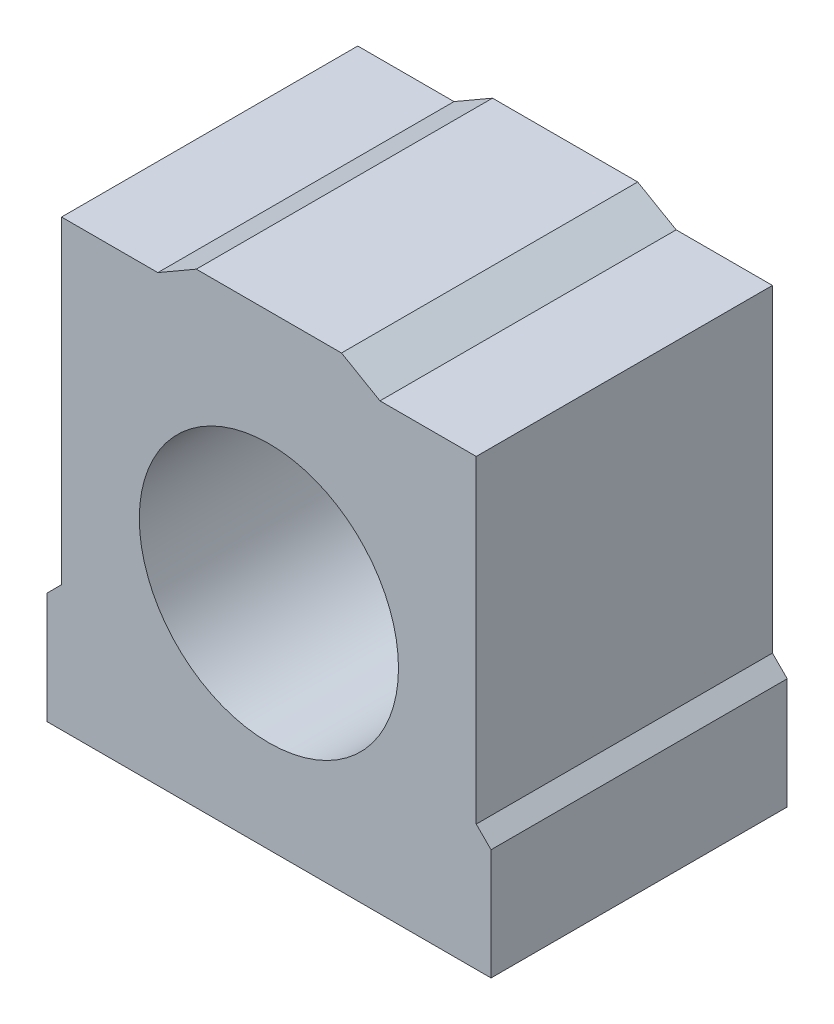
ISO-10303-21;
HEADER;
FILE_DESCRIPTION(('STEP AP214'),'2;1');
FILE_NAME('part.step','',(''),(''),'','','');
FILE_SCHEMA(('AUTOMOTIVE_DESIGN { 1 0 10303 214 1 1 1 1 }'));
ENDSEC;
DATA;
#1=APPLICATION_CONTEXT('core data for automotive mechanical design processes');
#2=APPLICATION_PROTOCOL_DEFINITION('international standard','automotive_design',2000,#1);
#3=PRODUCT_CONTEXT('',#1,'mechanical');
#4=PRODUCT('Part','Part','',(#3));
#5=PRODUCT_RELATED_PRODUCT_CATEGORY('part','',(#4));
#6=PRODUCT_DEFINITION_FORMATION('','',#4);
#7=PRODUCT_DEFINITION_CONTEXT('part definition',#1,'design');
#8=PRODUCT_DEFINITION('design','',#6,#7);
#9=PRODUCT_DEFINITION_SHAPE('','',#8);
#10=(LENGTH_UNIT() NAMED_UNIT(*) SI_UNIT(.MILLI.,.METRE.));
#11=(NAMED_UNIT(*) PLANE_ANGLE_UNIT() SI_UNIT($,.RADIAN.));
#12=(NAMED_UNIT(*) SI_UNIT($,.STERADIAN.) SOLID_ANGLE_UNIT());
#13=UNCERTAINTY_MEASURE_WITH_UNIT(LENGTH_MEASURE(1.E-05),#10,'distance_accuracy_value','');
#14=(GEOMETRIC_REPRESENTATION_CONTEXT(3) GLOBAL_UNCERTAINTY_ASSIGNED_CONTEXT((#13)) GLOBAL_UNIT_ASSIGNED_CONTEXT((#10,
#11,#12)) REPRESENTATION_CONTEXT('',''));
#15=CARTESIAN_POINT('',(0.,0.,0.));
#16=DIRECTION('',(0.,0.,1.));
#17=DIRECTION('',(1.,0.,0.));
#18=AXIS2_PLACEMENT_3D('',#15,#16,#17);
#19=CARTESIAN_POINT('',(0.,0.,20.));
#20=DIRECTION('',(0.,0.,-1.));
#21=DIRECTION('',(-1.,0.,0.));
#22=AXIS2_PLACEMENT_3D('',#19,#20,#21);
#23=PLANE('',#22);
#24=DIRECTION('',(0.,-1.,0.));
#25=VECTOR('',#24,1.);
#26=CARTESIAN_POINT('',(-30.,15.,20.));
#27=LINE('',#26,#25);
#28=CARTESIAN_POINT('',(-30.,15.,20.));
#29=VERTEX_POINT('',#28);
#30=CARTESIAN_POINT('',(-30.,0.,20.));
#31=VERTEX_POINT('',#30);
#32=EDGE_CURVE('E180',#29,#31,#27,.T.);
#33=ORIENTED_EDGE('',*,*,#32,.T.);
#34=DIRECTION('',(1.,0.,0.));
#35=VECTOR('',#34,1.);
#36=CARTESIAN_POINT('',(30.,0.,20.));
#37=LINE('',#36,#35);
#38=CARTESIAN_POINT('',(30.,0.,20.));
#39=VERTEX_POINT('',#38);
#40=EDGE_CURVE('E106',#31,#39,#37,.T.);
#41=ORIENTED_EDGE('',*,*,#40,.T.);
#42=DIRECTION('',(0.,1.,0.));
#43=VECTOR('',#42,1.);
#44=CARTESIAN_POINT('',(30.,15.,20.));
#45=LINE('',#44,#43);
#46=CARTESIAN_POINT('',(30.,15.,20.));
#47=VERTEX_POINT('',#46);
#48=EDGE_CURVE('E207',#39,#47,#45,.T.);
#49=ORIENTED_EDGE('',*,*,#48,.T.);
#50=DIRECTION('',(-0.707106781186544,0.707106781186551,0.));
#51=VECTOR('',#50,1.);
#52=CARTESIAN_POINT('',(28.,17.,20.));
#53=LINE('',#52,#51);
#54=CARTESIAN_POINT('',(28.,17.,20.));
#55=VERTEX_POINT('',#54);
#56=EDGE_CURVE('E226',#47,#55,#53,.T.);
#57=ORIENTED_EDGE('',*,*,#56,.T.);
#58=DIRECTION('',(0.,1.,0.));
#59=VECTOR('',#58,1.);
#60=CARTESIAN_POINT('',(28.,17.,20.));
#61=LINE('',#60,#59);
#62=CARTESIAN_POINT('',(28.,60.,20.));
#63=VERTEX_POINT('',#62);
#64=EDGE_CURVE('E223',#55,#63,#61,.T.);
#65=ORIENTED_EDGE('',*,*,#64,.T.);
#66=DIRECTION('',(-1.,0.,0.));
#67=VECTOR('',#66,1.);
#68=CARTESIAN_POINT('',(28.,60.,20.));
#69=LINE('',#68,#67);
#70=CARTESIAN_POINT('',(15.,60.,20.));
#71=VERTEX_POINT('',#70);
#72=EDGE_CURVE('E225',#63,#71,#69,.T.);
#73=ORIENTED_EDGE('',*,*,#72,.T.);
#74=DIRECTION('',(-0.866025403784442,0.499999999999995,0.));
#75=VECTOR('',#74,1.);
#76=CARTESIAN_POINT('',(15.,60.,20.));
#77=LINE('',#76,#75);
#78=CARTESIAN_POINT('',(9.80384757729329,63.,20.));
#79=VERTEX_POINT('',#78);
#80=EDGE_CURVE('E228',#71,#79,#77,.T.);
#81=ORIENTED_EDGE('',*,*,#80,.T.);
#82=DIRECTION('',(-1.,0.,0.));
#83=VECTOR('',#82,1.);
#84=CARTESIAN_POINT('',(-9.80384757729329,63.,20.));
#85=LINE('',#84,#83);
#86=CARTESIAN_POINT('',(-9.80384757729329,63.,20.));
#87=VERTEX_POINT('',#86);
#88=EDGE_CURVE('E234',#79,#87,#85,.T.);
#89=ORIENTED_EDGE('',*,*,#88,.T.);
#90=DIRECTION('',(-0.866025403784442,-0.499999999999995,0.));
#91=VECTOR('',#90,1.);
#92=CARTESIAN_POINT('',(-15.,60.,20.));
#93=LINE('',#92,#91);
#94=CARTESIAN_POINT('',(-15.,60.,20.));
#95=VERTEX_POINT('',#94);
#96=EDGE_CURVE('E139',#87,#95,#93,.T.);
#97=ORIENTED_EDGE('',*,*,#96,.T.);
#98=DIRECTION('',(-1.,0.,0.));
#99=VECTOR('',#98,1.);
#100=CARTESIAN_POINT('',(-15.,60.,20.));
#101=LINE('',#100,#99);
#102=CARTESIAN_POINT('',(-28.,60.,20.));
#103=VERTEX_POINT('',#102);
#104=EDGE_CURVE('E133',#95,#103,#101,.T.);
#105=ORIENTED_EDGE('',*,*,#104,.T.);
#106=DIRECTION('',(0.,-1.,0.));
#107=VECTOR('',#106,1.);
#108=CARTESIAN_POINT('',(-28.,17.,20.));
#109=LINE('',#108,#107);
#110=CARTESIAN_POINT('',(-28.,17.,20.));
#111=VERTEX_POINT('',#110);
#112=EDGE_CURVE('E137',#103,#111,#109,.T.);
#113=ORIENTED_EDGE('',*,*,#112,.T.);
#114=DIRECTION('',(-0.707106781186544,-0.707106781186551,0.));
#115=VECTOR('',#114,1.);
#116=CARTESIAN_POINT('',(-28.,17.,20.));
#117=LINE('',#116,#115);
#118=EDGE_CURVE('E50',#111,#29,#117,.T.);
#119=ORIENTED_EDGE('',*,*,#118,.T.);
#120=EDGE_LOOP('',(#33,#41,#49,#57,#65,#73,#81,#89,#97,#105,#113,#119));
#121=FACE_BOUND('',#120,.T.);
#122=CARTESIAN_POINT('',(0.,30.,20.));
#123=DIRECTION('',(0.,0.,1.));
#124=DIRECTION('',(1.,0.,0.));
#125=AXIS2_PLACEMENT_3D('',#122,#123,#124);
#126=CIRCLE('',#125,17.5);
#127=CARTESIAN_POINT('',(17.5,30.,20.));
#128=VERTEX_POINT('',#127);
#129=EDGE_CURVE('E161',#128,#128,#126,.T.);
#130=ORIENTED_EDGE('',*,*,#129,.F.);
#131=EDGE_LOOP('',(#130));
#132=FACE_BOUND('',#131,.T.);
#133=ADVANCED_FACE('F33',(#121,#132),#23,.F.);
#134=CARTESIAN_POINT('',(0.,0.,-20.));
#135=DIRECTION('',(0.,0.,-1.));
#136=DIRECTION('',(-1.,0.,0.));
#137=AXIS2_PLACEMENT_3D('',#134,#135,#136);
#138=PLANE('',#137);
#139=DIRECTION('',(0.,-1.,0.));
#140=VECTOR('',#139,1.);
#141=CARTESIAN_POINT('',(-30.,15.,-20.));
#142=LINE('',#141,#140);
#143=CARTESIAN_POINT('',(-30.,15.,-20.));
#144=VERTEX_POINT('',#143);
#145=CARTESIAN_POINT('',(-30.,0.,-20.));
#146=VERTEX_POINT('',#145);
#147=EDGE_CURVE('E157',#144,#146,#142,.T.);
#148=ORIENTED_EDGE('',*,*,#147,.F.);
#149=DIRECTION('',(-0.707106781186544,-0.707106781186551,0.));
#150=VECTOR('',#149,1.);
#151=CARTESIAN_POINT('',(-28.,17.,-20.));
#152=LINE('',#151,#150);
#153=CARTESIAN_POINT('',(-28.,17.,-20.));
#154=VERTEX_POINT('',#153);
#155=EDGE_CURVE('E98',#154,#144,#152,.T.);
#156=ORIENTED_EDGE('',*,*,#155,.F.);
#157=DIRECTION('',(0.,-1.,0.));
#158=VECTOR('',#157,1.);
#159=CARTESIAN_POINT('',(-28.,17.,-20.));
#160=LINE('',#159,#158);
#161=CARTESIAN_POINT('',(-28.,60.,-20.));
#162=VERTEX_POINT('',#161);
#163=EDGE_CURVE('E92',#162,#154,#160,.T.);
#164=ORIENTED_EDGE('',*,*,#163,.F.);
#165=DIRECTION('',(-1.,0.,0.));
#166=VECTOR('',#165,1.);
#167=CARTESIAN_POINT('',(-15.,60.,-20.));
#168=LINE('',#167,#166);
#169=CARTESIAN_POINT('',(-15.,60.,-20.));
#170=VERTEX_POINT('',#169);
#171=EDGE_CURVE('E147',#170,#162,#168,.T.);
#172=ORIENTED_EDGE('',*,*,#171,.F.);
#173=DIRECTION('',(-0.866025403784442,-0.499999999999995,0.));
#174=VECTOR('',#173,1.);
#175=CARTESIAN_POINT('',(-15.,60.,-20.));
#176=LINE('',#175,#174);
#177=CARTESIAN_POINT('',(-9.80384757729329,63.,-20.));
#178=VERTEX_POINT('',#177);
#179=EDGE_CURVE('E175',#178,#170,#176,.T.);
#180=ORIENTED_EDGE('',*,*,#179,.F.);
#181=DIRECTION('',(-1.,0.,0.));
#182=VECTOR('',#181,1.);
#183=CARTESIAN_POINT('',(-9.80384757729329,63.,-20.));
#184=LINE('',#183,#182);
#185=CARTESIAN_POINT('',(9.80384757729329,63.,-20.));
#186=VERTEX_POINT('',#185);
#187=EDGE_CURVE('E173',#186,#178,#184,.T.);
#188=ORIENTED_EDGE('',*,*,#187,.F.);
#189=DIRECTION('',(-0.866025403784442,0.499999999999995,0.));
#190=VECTOR('',#189,1.);
#191=CARTESIAN_POINT('',(15.,60.,-20.));
#192=LINE('',#191,#190);
#193=CARTESIAN_POINT('',(15.,60.,-20.));
#194=VERTEX_POINT('',#193);
#195=EDGE_CURVE('E171',#194,#186,#192,.T.);
#196=ORIENTED_EDGE('',*,*,#195,.F.);
#197=DIRECTION('',(-1.,0.,0.));
#198=VECTOR('',#197,1.);
#199=CARTESIAN_POINT('',(28.,60.,-20.));
#200=LINE('',#199,#198);
#201=CARTESIAN_POINT('',(28.,60.,-20.));
#202=VERTEX_POINT('',#201);
#203=EDGE_CURVE('E169',#202,#194,#200,.T.);
#204=ORIENTED_EDGE('',*,*,#203,.F.);
#205=DIRECTION('',(0.,1.,0.));
#206=VECTOR('',#205,1.);
#207=CARTESIAN_POINT('',(28.,17.,-20.));
#208=LINE('',#207,#206);
#209=CARTESIAN_POINT('',(28.,17.,-20.));
#210=VERTEX_POINT('',#209);
#211=EDGE_CURVE('E167',#210,#202,#208,.T.);
#212=ORIENTED_EDGE('',*,*,#211,.F.);
#213=DIRECTION('',(-0.707106781186544,0.707106781186551,0.));
#214=VECTOR('',#213,1.);
#215=CARTESIAN_POINT('',(28.,17.,-20.));
#216=LINE('',#215,#214);
#217=CARTESIAN_POINT('',(30.,15.,-20.));
#218=VERTEX_POINT('',#217);
#219=EDGE_CURVE('E165',#218,#210,#216,.T.);
#220=ORIENTED_EDGE('',*,*,#219,.F.);
#221=DIRECTION('',(0.,1.,0.));
#222=VECTOR('',#221,1.);
#223=CARTESIAN_POINT('',(30.,15.,-20.));
#224=LINE('',#223,#222);
#225=CARTESIAN_POINT('',(30.,0.,-20.));
#226=VERTEX_POINT('',#225);
#227=EDGE_CURVE('E163',#226,#218,#224,.T.);
#228=ORIENTED_EDGE('',*,*,#227,.F.);
#229=DIRECTION('',(1.,0.,0.));
#230=VECTOR('',#229,1.);
#231=CARTESIAN_POINT('',(30.,0.,-20.));
#232=LINE('',#231,#230);
#233=EDGE_CURVE('E160',#146,#226,#232,.T.);
#234=ORIENTED_EDGE('',*,*,#233,.F.);
#235=EDGE_LOOP('',(#148,#156,#164,#172,#180,#188,#196,#204,#212,#220,#228,#234));
#236=FACE_BOUND('',#235,.T.);
#237=CARTESIAN_POINT('',(0.,30.,-20.));
#238=DIRECTION('',(0.,0.,1.));
#239=DIRECTION('',(1.,0.,0.));
#240=AXIS2_PLACEMENT_3D('',#237,#238,#239);
#241=CIRCLE('',#240,17.5);
#242=CARTESIAN_POINT('',(17.5,30.,-20.));
#243=VERTEX_POINT('',#242);
#244=EDGE_CURVE('E328',#243,#243,#241,.T.);
#245=ORIENTED_EDGE('',*,*,#244,.T.);
#246=EDGE_LOOP('',(#245));
#247=FACE_BOUND('',#246,.T.);
#248=ADVANCED_FACE('F211',(#236,#247),#138,.T.);
#249=CARTESIAN_POINT('',(-30.,15.,20.));
#250=DIRECTION('',(1.,0.,0.));
#251=DIRECTION('',(0.,1.,0.));
#252=AXIS2_PLACEMENT_3D('',#249,#250,#251);
#253=PLANE('',#252);
#254=ORIENTED_EDGE('',*,*,#147,.T.);
#255=DIRECTION('',(0.,0.,-1.));
#256=VECTOR('',#255,1.);
#257=CARTESIAN_POINT('',(-30.,0.,20.));
#258=LINE('',#257,#256);
#259=EDGE_CURVE('E11',#31,#146,#258,.T.);
#260=ORIENTED_EDGE('',*,*,#259,.F.);
#261=ORIENTED_EDGE('',*,*,#32,.F.);
#262=DIRECTION('',(0.,0.,-1.));
#263=VECTOR('',#262,1.);
#264=CARTESIAN_POINT('',(-30.,15.,20.));
#265=LINE('',#264,#263);
#266=EDGE_CURVE('E153',#29,#144,#265,.T.);
#267=ORIENTED_EDGE('',*,*,#266,.T.);
#268=EDGE_LOOP('',(#254,#260,#261,#267));
#269=FACE_BOUND('',#268,.T.);
#270=ADVANCED_FACE('F35',(#269),#253,.F.);
#271=CARTESIAN_POINT('',(30.,0.,20.));
#272=DIRECTION('',(0.,1.,0.));
#273=DIRECTION('',(0.,0.,1.));
#274=AXIS2_PLACEMENT_3D('',#271,#272,#273);
#275=PLANE('',#274);
#276=CARTESIAN_POINT('',(-20.,0.,-10.));
#277=DIRECTION('',(0.,-1.,0.));
#278=DIRECTION('',(0.,0.,-1.));
#279=AXIS2_PLACEMENT_3D('',#276,#277,#278);
#280=CIRCLE('',#279,2.5527);
#281=CARTESIAN_POINT('',(-20.,0.,-12.5527));
#282=VERTEX_POINT('',#281);
#283=EDGE_CURVE('E305',#282,#282,#280,.T.);
#284=ORIENTED_EDGE('',*,*,#283,.F.);
#285=EDGE_LOOP('',(#284));
#286=FACE_BOUND('',#285,.T.);
#287=CARTESIAN_POINT('',(-20.,0.,10.));
#288=DIRECTION('',(0.,-1.,0.));
#289=DIRECTION('',(0.,0.,-1.));
#290=AXIS2_PLACEMENT_3D('',#287,#288,#289);
#291=CIRCLE('',#290,2.5527);
#292=CARTESIAN_POINT('',(-20.,0.,7.4473));
#293=VERTEX_POINT('',#292);
#294=EDGE_CURVE('E308',#293,#293,#291,.T.);
#295=ORIENTED_EDGE('',*,*,#294,.F.);
#296=EDGE_LOOP('',(#295));
#297=FACE_BOUND('',#296,.T.);
#298=CARTESIAN_POINT('',(20.,0.,9.99999999999999));
#299=DIRECTION('',(0.,-1.,0.));
#300=DIRECTION('',(0.,0.,-1.));
#301=AXIS2_PLACEMENT_3D('',#298,#299,#300);
#302=CIRCLE('',#301,2.5527);
#303=CARTESIAN_POINT('',(20.,0.,7.44729999999999));
#304=VERTEX_POINT('',#303);
#305=EDGE_CURVE('E316',#304,#304,#302,.T.);
#306=ORIENTED_EDGE('',*,*,#305,.F.);
#307=EDGE_LOOP('',(#306));
#308=FACE_BOUND('',#307,.T.);
#309=CARTESIAN_POINT('',(20.,0.,-9.99999999999999));
#310=DIRECTION('',(0.,-1.,0.));
#311=DIRECTION('',(0.,0.,-1.));
#312=AXIS2_PLACEMENT_3D('',#309,#310,#311);
#313=CIRCLE('',#312,2.5527);
#314=CARTESIAN_POINT('',(20.,0.,-12.5527));
#315=VERTEX_POINT('',#314);
#316=EDGE_CURVE('E322',#315,#315,#313,.T.);
#317=ORIENTED_EDGE('',*,*,#316,.F.);
#318=EDGE_LOOP('',(#317));
#319=FACE_BOUND('',#318,.T.);
#320=ORIENTED_EDGE('',*,*,#233,.T.);
#321=DIRECTION('',(0.,0.,-1.));
#322=VECTOR('',#321,1.);
#323=CARTESIAN_POINT('',(30.,0.,20.));
#324=LINE('',#323,#322);
#325=EDGE_CURVE('E42',#39,#226,#324,.T.);
#326=ORIENTED_EDGE('',*,*,#325,.F.);
#327=ORIENTED_EDGE('',*,*,#40,.F.);
#328=ORIENTED_EDGE('',*,*,#259,.T.);
#329=EDGE_LOOP('',(#320,#326,#327,#328));
#330=FACE_BOUND('',#329,.T.);
#331=ADVANCED_FACE('F342',(#286,#297,#308,#319,#330),#275,.F.);
#332=CARTESIAN_POINT('',(30.,15.,20.));
#333=DIRECTION('',(-1.,0.,0.));
#334=DIRECTION('',(0.,-1.,0.));
#335=AXIS2_PLACEMENT_3D('',#332,#333,#334);
#336=PLANE('',#335);
#337=ORIENTED_EDGE('',*,*,#227,.T.);
#338=DIRECTION('',(0.,0.,-1.));
#339=VECTOR('',#338,1.);
#340=CARTESIAN_POINT('',(30.,15.,20.));
#341=LINE('',#340,#339);
#342=EDGE_CURVE('E199',#47,#218,#341,.T.);
#343=ORIENTED_EDGE('',*,*,#342,.F.);
#344=ORIENTED_EDGE('',*,*,#48,.F.);
#345=ORIENTED_EDGE('',*,*,#325,.T.);
#346=EDGE_LOOP('',(#337,#343,#344,#345));
#347=FACE_BOUND('',#346,.T.);
#348=ADVANCED_FACE('F205',(#347),#336,.F.);
#349=CARTESIAN_POINT('',(28.,17.,20.));
#350=DIRECTION('',(-0.707106781186551,-0.707106781186544,0.));
#351=DIRECTION('',(0.707106781186544,-0.707106781186551,0.));
#352=AXIS2_PLACEMENT_3D('',#349,#350,#351);
#353=PLANE('',#352);
#354=ORIENTED_EDGE('',*,*,#219,.T.);
#355=DIRECTION('',(0.,0.,-1.));
#356=VECTOR('',#355,1.);
#357=CARTESIAN_POINT('',(28.,17.,20.));
#358=LINE('',#357,#356);
#359=EDGE_CURVE('E196',#55,#210,#358,.T.);
#360=ORIENTED_EDGE('',*,*,#359,.F.);
#361=ORIENTED_EDGE('',*,*,#56,.F.);
#362=ORIENTED_EDGE('',*,*,#342,.T.);
#363=EDGE_LOOP('',(#354,#360,#361,#362));
#364=FACE_BOUND('',#363,.T.);
#365=ADVANCED_FACE('F217',(#364),#353,.F.);
#366=CARTESIAN_POINT('',(28.,17.,20.));
#367=DIRECTION('',(-1.,0.,0.));
#368=DIRECTION('',(0.,0.,1.));
#369=AXIS2_PLACEMENT_3D('',#366,#367,#368);
#370=PLANE('',#369);
#371=ORIENTED_EDGE('',*,*,#211,.T.);
#372=DIRECTION('',(0.,0.,-1.));
#373=VECTOR('',#372,1.);
#374=CARTESIAN_POINT('',(28.,60.,20.));
#375=LINE('',#374,#373);
#376=EDGE_CURVE('E193',#63,#202,#375,.T.);
#377=ORIENTED_EDGE('',*,*,#376,.F.);
#378=ORIENTED_EDGE('',*,*,#64,.F.);
#379=ORIENTED_EDGE('',*,*,#359,.T.);
#380=EDGE_LOOP('',(#371,#377,#378,#379));
#381=FACE_BOUND('',#380,.T.);
#382=ADVANCED_FACE('F221',(#381),#370,.F.);
#383=CARTESIAN_POINT('',(28.,60.,20.));
#384=DIRECTION('',(0.,-1.,0.));
#385=DIRECTION('',(1.,0.,0.));
#386=AXIS2_PLACEMENT_3D('',#383,#384,#385);
#387=PLANE('',#386);
#388=ORIENTED_EDGE('',*,*,#203,.T.);
#389=DIRECTION('',(0.,0.,-1.));
#390=VECTOR('',#389,1.);
#391=CARTESIAN_POINT('',(15.,60.,20.));
#392=LINE('',#391,#390);
#393=EDGE_CURVE('E190',#71,#194,#392,.T.);
#394=ORIENTED_EDGE('',*,*,#393,.F.);
#395=ORIENTED_EDGE('',*,*,#72,.F.);
#396=ORIENTED_EDGE('',*,*,#376,.T.);
#397=EDGE_LOOP('',(#388,#394,#395,#396));
#398=FACE_BOUND('',#397,.T.);
#399=ADVANCED_FACE('F355',(#398),#387,.F.);
#400=CARTESIAN_POINT('',(15.,60.,20.));
#401=DIRECTION('',(-0.499999999999995,-0.866025403784442,0.));
#402=DIRECTION('',(0.866025403784442,-0.499999999999995,0.));
#403=AXIS2_PLACEMENT_3D('',#400,#401,#402);
#404=PLANE('',#403);
#405=ORIENTED_EDGE('',*,*,#195,.T.);
#406=DIRECTION('',(0.,0.,-1.));
#407=VECTOR('',#406,1.);
#408=CARTESIAN_POINT('',(9.80384757729329,63.,20.));
#409=LINE('',#408,#407);
#410=EDGE_CURVE('E187',#79,#186,#409,.T.);
#411=ORIENTED_EDGE('',*,*,#410,.F.);
#412=ORIENTED_EDGE('',*,*,#80,.F.);
#413=ORIENTED_EDGE('',*,*,#393,.T.);
#414=EDGE_LOOP('',(#405,#411,#412,#413));
#415=FACE_BOUND('',#414,.T.);
#416=ADVANCED_FACE('F358',(#415),#404,.F.);
#417=CARTESIAN_POINT('',(-9.80384757729329,63.,20.));
#418=DIRECTION('',(0.,-1.,0.));
#419=DIRECTION('',(0.,0.,-1.));
#420=AXIS2_PLACEMENT_3D('',#417,#418,#419);
#421=PLANE('',#420);
#422=ORIENTED_EDGE('',*,*,#187,.T.);
#423=DIRECTION('',(0.,0.,-1.));
#424=VECTOR('',#423,1.);
#425=CARTESIAN_POINT('',(-9.80384757729329,63.,20.));
#426=LINE('',#425,#424);
#427=EDGE_CURVE('E184',#87,#178,#426,.T.);
#428=ORIENTED_EDGE('',*,*,#427,.F.);
#429=ORIENTED_EDGE('',*,*,#88,.F.);
#430=ORIENTED_EDGE('',*,*,#410,.T.);
#431=EDGE_LOOP('',(#422,#428,#429,#430));
#432=FACE_BOUND('',#431,.T.);
#433=ADVANCED_FACE('F240',(#432),#421,.F.);
#434=CARTESIAN_POINT('',(-15.,60.,20.));
#435=DIRECTION('',(0.499999999999995,-0.866025403784442,0.));
#436=DIRECTION('',(0.866025403784442,0.499999999999995,0.));
#437=AXIS2_PLACEMENT_3D('',#434,#435,#436);
#438=PLANE('',#437);
#439=ORIENTED_EDGE('',*,*,#179,.T.);
#440=DIRECTION('',(0.,0.,-1.));
#441=VECTOR('',#440,1.);
#442=CARTESIAN_POINT('',(-15.,60.,20.));
#443=LINE('',#442,#441);
#444=EDGE_CURVE('E148',#95,#170,#443,.T.);
#445=ORIENTED_EDGE('',*,*,#444,.F.);
#446=ORIENTED_EDGE('',*,*,#96,.F.);
#447=ORIENTED_EDGE('',*,*,#427,.T.);
#448=EDGE_LOOP('',(#439,#445,#446,#447));
#449=FACE_BOUND('',#448,.T.);
#450=ADVANCED_FACE('F244',(#449),#438,.F.);
#451=CARTESIAN_POINT('',(-15.,60.,20.));
#452=DIRECTION('',(0.,-1.,0.));
#453=DIRECTION('',(1.,0.,0.));
#454=AXIS2_PLACEMENT_3D('',#451,#452,#453);
#455=PLANE('',#454);
#456=ORIENTED_EDGE('',*,*,#171,.T.);
#457=DIRECTION('',(0.,0.,-1.));
#458=VECTOR('',#457,1.);
#459=CARTESIAN_POINT('',(-28.,60.,20.));
#460=LINE('',#459,#458);
#461=EDGE_CURVE('E144',#103,#162,#460,.T.);
#462=ORIENTED_EDGE('',*,*,#461,.F.);
#463=ORIENTED_EDGE('',*,*,#104,.F.);
#464=ORIENTED_EDGE('',*,*,#444,.T.);
#465=EDGE_LOOP('',(#456,#462,#463,#464));
#466=FACE_BOUND('',#465,.T.);
#467=ADVANCED_FACE('F145',(#466),#455,.F.);
#468=CARTESIAN_POINT('',(-28.,17.,20.));
#469=DIRECTION('',(1.,0.,0.));
#470=DIRECTION('',(0.,0.,-1.));
#471=AXIS2_PLACEMENT_3D('',#468,#469,#470);
#472=PLANE('',#471);
#473=ORIENTED_EDGE('',*,*,#163,.T.);
#474=DIRECTION('',(0.,0.,-1.));
#475=VECTOR('',#474,1.);
#476=CARTESIAN_POINT('',(-28.,17.,20.));
#477=LINE('',#476,#475);
#478=EDGE_CURVE('E149',#111,#154,#477,.T.);
#479=ORIENTED_EDGE('',*,*,#478,.F.);
#480=ORIENTED_EDGE('',*,*,#112,.F.);
#481=ORIENTED_EDGE('',*,*,#461,.T.);
#482=EDGE_LOOP('',(#473,#479,#480,#481));
#483=FACE_BOUND('',#482,.T.);
#484=ADVANCED_FACE('F151',(#483),#472,.F.);
#485=CARTESIAN_POINT('',(-28.,17.,20.));
#486=DIRECTION('',(0.707106781186551,-0.707106781186544,0.));
#487=DIRECTION('',(0.707106781186544,0.707106781186551,0.));
#488=AXIS2_PLACEMENT_3D('',#485,#486,#487);
#489=PLANE('',#488);
#490=ORIENTED_EDGE('',*,*,#155,.T.);
#491=ORIENTED_EDGE('',*,*,#266,.F.);
#492=ORIENTED_EDGE('',*,*,#118,.F.);
#493=ORIENTED_EDGE('',*,*,#478,.T.);
#494=EDGE_LOOP('',(#490,#491,#492,#493));
#495=FACE_BOUND('',#494,.T.);
#496=ADVANCED_FACE('F248',(#495),#489,.F.);
#497=CARTESIAN_POINT('',(0.,30.,20.));
#498=DIRECTION('',(0.,0.,-1.));
#499=DIRECTION('',(-1.,0.,0.));
#500=AXIS2_PLACEMENT_3D('',#497,#498,#499);
#501=CYLINDRICAL_SURFACE('',#500,17.5);
#502=ORIENTED_EDGE('',*,*,#129,.T.);
#503=EDGE_LOOP('',(#502));
#504=FACE_BOUND('',#503,.T.);
#505=ORIENTED_EDGE('',*,*,#244,.F.);
#506=EDGE_LOOP('',(#505));
#507=FACE_BOUND('',#506,.T.);
#508=ADVANCED_FACE('F250',(#504,#507),#501,.F.);
#509=CARTESIAN_POINT('',(20.,19.05,-9.99999999999999));
#510=DIRECTION('',(0.,-1.,0.));
#511=DIRECTION('',(0.,0.,-1.));
#512=AXIS2_PLACEMENT_3D('',#509,#510,#511);
#513=CONICAL_SURFACE('',#512,2.5527,1.02974425867665);
#514=CARTESIAN_POINT('',(20.,20.5838169021917,-9.99999999999999));
#515=VERTEX_POINT('',#514);
#516=VERTEX_LOOP('',#515);
#517=FACE_BOUND('',#516,.T.);
#518=CARTESIAN_POINT('',(20.,19.05,-9.99999999999999));
#519=DIRECTION('',(0.,-1.,0.));
#520=DIRECTION('',(0.,0.,-1.));
#521=AXIS2_PLACEMENT_3D('',#518,#519,#520);
#522=CIRCLE('',#521,2.5527);
#523=CARTESIAN_POINT('',(20.,19.05,-12.5527));
#524=VERTEX_POINT('',#523);
#525=EDGE_CURVE('E325',#524,#524,#522,.T.);
#526=ORIENTED_EDGE('',*,*,#525,.T.);
#527=EDGE_LOOP('',(#526));
#528=FACE_BOUND('',#527,.T.);
#529=ADVANCED_FACE('F256',(#517,#528),#513,.F.);
#530=CARTESIAN_POINT('',(20.,0.,-9.99999999999999));
#531=DIRECTION('',(0.,-1.,0.));
#532=DIRECTION('',(0.,0.,-1.));
#533=AXIS2_PLACEMENT_3D('',#530,#531,#532);
#534=CYLINDRICAL_SURFACE('',#533,2.5527);
#535=ORIENTED_EDGE('',*,*,#525,.F.);
#536=EDGE_LOOP('',(#535));
#537=FACE_BOUND('',#536,.T.);
#538=ORIENTED_EDGE('',*,*,#316,.T.);
#539=EDGE_LOOP('',(#538));
#540=FACE_BOUND('',#539,.T.);
#541=ADVANCED_FACE('F269',(#537,#540),#534,.F.);
#542=CARTESIAN_POINT('',(20.,19.05,9.99999999999999));
#543=DIRECTION('',(0.,-1.,0.));
#544=DIRECTION('',(0.,0.,-1.));
#545=AXIS2_PLACEMENT_3D('',#542,#543,#544);
#546=CONICAL_SURFACE('',#545,2.5527,1.02974425867665);
#547=CARTESIAN_POINT('',(20.,20.5838169021917,9.99999999999999));
#548=VERTEX_POINT('',#547);
#549=VERTEX_LOOP('',#548);
#550=FACE_BOUND('',#549,.T.);
#551=CARTESIAN_POINT('',(20.,19.05,9.99999999999999));
#552=DIRECTION('',(0.,-1.,0.));
#553=DIRECTION('',(0.,0.,-1.));
#554=AXIS2_PLACEMENT_3D('',#551,#552,#553);
#555=CIRCLE('',#554,2.5527);
#556=CARTESIAN_POINT('',(20.,19.05,7.44729999999999));
#557=VERTEX_POINT('',#556);
#558=EDGE_CURVE('E319',#557,#557,#555,.T.);
#559=ORIENTED_EDGE('',*,*,#558,.T.);
#560=EDGE_LOOP('',(#559));
#561=FACE_BOUND('',#560,.T.);
#562=ADVANCED_FACE('F273',(#550,#561),#546,.F.);
#563=CARTESIAN_POINT('',(20.,0.,9.99999999999999));
#564=DIRECTION('',(0.,-1.,0.));
#565=DIRECTION('',(0.,0.,-1.));
#566=AXIS2_PLACEMENT_3D('',#563,#564,#565);
#567=CYLINDRICAL_SURFACE('',#566,2.5527);
#568=ORIENTED_EDGE('',*,*,#558,.F.);
#569=EDGE_LOOP('',(#568));
#570=FACE_BOUND('',#569,.T.);
#571=ORIENTED_EDGE('',*,*,#305,.T.);
#572=EDGE_LOOP('',(#571));
#573=FACE_BOUND('',#572,.T.);
#574=ADVANCED_FACE('F277',(#570,#573),#567,.F.);
#575=CARTESIAN_POINT('',(-20.,19.05,10.));
#576=DIRECTION('',(0.,-1.,0.));
#577=DIRECTION('',(0.,0.,-1.));
#578=AXIS2_PLACEMENT_3D('',#575,#576,#577);
#579=CONICAL_SURFACE('',#578,2.5527,1.02974425867665);
#580=CARTESIAN_POINT('',(-20.,20.5838169021917,10.));
#581=VERTEX_POINT('',#580);
#582=VERTEX_LOOP('',#581);
#583=FACE_BOUND('',#582,.T.);
#584=CARTESIAN_POINT('',(-20.,19.05,10.));
#585=DIRECTION('',(0.,-1.,0.));
#586=DIRECTION('',(0.,0.,-1.));
#587=AXIS2_PLACEMENT_3D('',#584,#585,#586);
#588=CIRCLE('',#587,2.5527);
#589=CARTESIAN_POINT('',(-20.,19.05,7.4473));
#590=VERTEX_POINT('',#589);
#591=EDGE_CURVE('E313',#590,#590,#588,.T.);
#592=ORIENTED_EDGE('',*,*,#591,.T.);
#593=EDGE_LOOP('',(#592));
#594=FACE_BOUND('',#593,.T.);
#595=ADVANCED_FACE('F281',(#583,#594),#579,.F.);
#596=CARTESIAN_POINT('',(-20.,0.,10.));
#597=DIRECTION('',(0.,-1.,0.));
#598=DIRECTION('',(0.,0.,-1.));
#599=AXIS2_PLACEMENT_3D('',#596,#597,#598);
#600=CYLINDRICAL_SURFACE('',#599,2.5527);
#601=ORIENTED_EDGE('',*,*,#591,.F.);
#602=EDGE_LOOP('',(#601));
#603=FACE_BOUND('',#602,.T.);
#604=ORIENTED_EDGE('',*,*,#294,.T.);
#605=EDGE_LOOP('',(#604));
#606=FACE_BOUND('',#605,.T.);
#607=ADVANCED_FACE('F285',(#603,#606),#600,.F.);
#608=CARTESIAN_POINT('',(-20.,19.05,-10.));
#609=DIRECTION('',(0.,-1.,0.));
#610=DIRECTION('',(0.,0.,-1.));
#611=AXIS2_PLACEMENT_3D('',#608,#609,#610);
#612=CONICAL_SURFACE('',#611,2.5527,1.02974425867665);
#613=CARTESIAN_POINT('',(-20.,20.5838169021917,-10.));
#614=VERTEX_POINT('',#613);
#615=VERTEX_LOOP('',#614);
#616=FACE_BOUND('',#615,.T.);
#617=CARTESIAN_POINT('',(-20.,19.05,-10.));
#618=DIRECTION('',(0.,-1.,0.));
#619=DIRECTION('',(0.,0.,-1.));
#620=AXIS2_PLACEMENT_3D('',#617,#618,#619);
#621=CIRCLE('',#620,2.5527);
#622=CARTESIAN_POINT('',(-20.,19.05,-12.5527));
#623=VERTEX_POINT('',#622);
#624=EDGE_CURVE('E302',#623,#623,#621,.T.);
#625=ORIENTED_EDGE('',*,*,#624,.T.);
#626=EDGE_LOOP('',(#625));
#627=FACE_BOUND('',#626,.T.);
#628=ADVANCED_FACE('F289',(#616,#627),#612,.F.);
#629=CARTESIAN_POINT('',(-20.,0.,-10.));
#630=DIRECTION('',(0.,-1.,0.));
#631=DIRECTION('',(0.,0.,-1.));
#632=AXIS2_PLACEMENT_3D('',#629,#630,#631);
#633=CYLINDRICAL_SURFACE('',#632,2.5527);
#634=ORIENTED_EDGE('',*,*,#624,.F.);
#635=EDGE_LOOP('',(#634));
#636=FACE_BOUND('',#635,.T.);
#637=ORIENTED_EDGE('',*,*,#283,.T.);
#638=EDGE_LOOP('',(#637));
#639=FACE_BOUND('',#638,.T.);
#640=ADVANCED_FACE('F293',(#636,#639),#633,.F.);
#641=CLOSED_SHELL('',(#133,#248,#270,#331,#348,#365,#382,#399,#416,#433,#450,#467,#484,#496,
#508,#529,#541,#562,#574,#595,#607,#628,#640));
#642=MANIFOLD_SOLID_BREP('B2',#641);
#643=ADVANCED_BREP_SHAPE_REPRESENTATION('',(#18,#642),#14);
#644=SHAPE_DEFINITION_REPRESENTATION(#9,#643);
ENDSEC;
END-ISO-10303-21;
